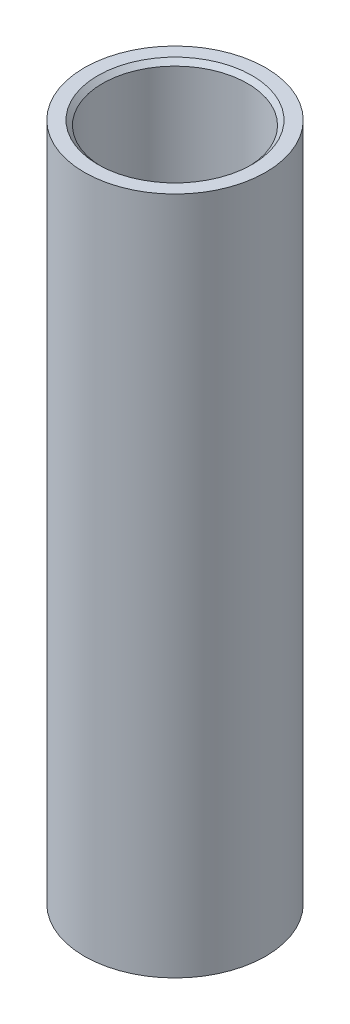
ISO-10303-21;
HEADER;
FILE_DESCRIPTION(('STEP AP214'),'2;1');
FILE_NAME('part.step','',(''),(''),'','','');
FILE_SCHEMA(('AUTOMOTIVE_DESIGN { 1 0 10303 214 1 1 1 1 }'));
ENDSEC;
DATA;
#1=APPLICATION_CONTEXT('core data for automotive mechanical design processes');
#2=APPLICATION_PROTOCOL_DEFINITION('international standard','automotive_design',2000,#1);
#3=PRODUCT_CONTEXT('',#1,'mechanical');
#4=PRODUCT('Part','Part','',(#3));
#5=PRODUCT_RELATED_PRODUCT_CATEGORY('part','',(#4));
#6=PRODUCT_DEFINITION_FORMATION('','',#4);
#7=PRODUCT_DEFINITION_CONTEXT('part definition',#1,'design');
#8=PRODUCT_DEFINITION('design','',#6,#7);
#9=PRODUCT_DEFINITION_SHAPE('','',#8);
#10=(LENGTH_UNIT() NAMED_UNIT(*) SI_UNIT(.MILLI.,.METRE.));
#11=(NAMED_UNIT(*) PLANE_ANGLE_UNIT() SI_UNIT($,.RADIAN.));
#12=(NAMED_UNIT(*) SI_UNIT($,.STERADIAN.) SOLID_ANGLE_UNIT());
#13=UNCERTAINTY_MEASURE_WITH_UNIT(LENGTH_MEASURE(1.E-05),#10,'distance_accuracy_value','');
#14=(GEOMETRIC_REPRESENTATION_CONTEXT(3) GLOBAL_UNCERTAINTY_ASSIGNED_CONTEXT((#13)) GLOBAL_UNIT_ASSIGNED_CONTEXT((#10,
#11,#12)) REPRESENTATION_CONTEXT('',''));
#15=CARTESIAN_POINT('',(0.,0.,0.));
#16=DIRECTION('',(0.,0.,1.));
#17=DIRECTION('',(1.,0.,0.));
#18=AXIS2_PLACEMENT_3D('',#15,#16,#17);
#19=CARTESIAN_POINT('',(0.,29.718,0.));
#20=DIRECTION('',(0.,1.,0.));
#21=DIRECTION('',(0.,0.,1.));
#22=AXIS2_PLACEMENT_3D('',#19,#20,#21);
#23=PLANE('',#22);
#24=CARTESIAN_POINT('',(0.,29.718,0.));
#25=DIRECTION('',(0.,1.,0.));
#26=DIRECTION('',(0.,0.,1.));
#27=AXIS2_PLACEMENT_3D('',#24,#25,#26);
#28=CIRCLE('',#27,3.375);
#29=CARTESIAN_POINT('',(0.,29.718,3.375));
#30=VERTEX_POINT('',#29);
#31=EDGE_CURVE('E10',#30,#30,#28,.F.);
#32=ORIENTED_EDGE('',*,*,#31,.T.);
#33=EDGE_LOOP('',(#32));
#34=FACE_BOUND('',#33,.T.);
#35=CARTESIAN_POINT('',(0.,29.718,0.));
#36=DIRECTION('',(0.,1.,0.));
#37=DIRECTION('',(0.,0.,1.));
#38=AXIS2_PLACEMENT_3D('',#35,#36,#37);
#39=CIRCLE('',#38,3.96875);
#40=CARTESIAN_POINT('',(0.,29.718,3.96875));
#41=VERTEX_POINT('',#40);
#42=EDGE_CURVE('E51',#41,#41,#39,.T.);
#43=ORIENTED_EDGE('',*,*,#42,.T.);
#44=EDGE_LOOP('',(#43));
#45=FACE_BOUND('',#44,.T.);
#46=ADVANCED_FACE('F31',(#34,#45),#23,.T.);
#47=CARTESIAN_POINT('',(0.,0.,0.));
#48=DIRECTION('',(0.,1.,0.));
#49=DIRECTION('',(0.,0.,1.));
#50=AXIS2_PLACEMENT_3D('',#47,#48,#49);
#51=PLANE('',#50);
#52=CARTESIAN_POINT('',(0.,0.,0.));
#53=DIRECTION('',(0.,1.,0.));
#54=DIRECTION('',(0.,0.,1.));
#55=AXIS2_PLACEMENT_3D('',#52,#53,#54);
#56=CIRCLE('',#55,3.375);
#57=CARTESIAN_POINT('',(0.,0.,3.375));
#58=VERTEX_POINT('',#57);
#59=EDGE_CURVE('E46',#58,#58,#56,.T.);
#60=ORIENTED_EDGE('',*,*,#59,.T.);
#61=EDGE_LOOP('',(#60));
#62=FACE_BOUND('',#61,.T.);
#63=CARTESIAN_POINT('',(0.,0.,0.));
#64=DIRECTION('',(0.,1.,0.));
#65=DIRECTION('',(0.,0.,1.));
#66=AXIS2_PLACEMENT_3D('',#63,#64,#65);
#67=CIRCLE('',#66,3.96875);
#68=CARTESIAN_POINT('',(0.,0.,3.96875));
#69=VERTEX_POINT('',#68);
#70=EDGE_CURVE('E52',#69,#69,#67,.T.);
#71=ORIENTED_EDGE('',*,*,#70,.F.);
#72=EDGE_LOOP('',(#71));
#73=FACE_BOUND('',#72,.T.);
#74=ADVANCED_FACE('F63',(#62,#73),#51,.F.);
#75=CARTESIAN_POINT('',(0.,29.718,0.));
#76=DIRECTION('',(0.,-1.,0.));
#77=DIRECTION('',(0.,0.,-1.));
#78=AXIS2_PLACEMENT_3D('',#75,#76,#77);
#79=CYLINDRICAL_SURFACE('',#78,3.96875);
#80=ORIENTED_EDGE('',*,*,#42,.F.);
#81=EDGE_LOOP('',(#80));
#82=FACE_BOUND('',#81,.T.);
#83=ORIENTED_EDGE('',*,*,#70,.T.);
#84=EDGE_LOOP('',(#83));
#85=FACE_BOUND('',#84,.T.);
#86=ADVANCED_FACE('F59',(#82,#85),#79,.T.);
#87=CARTESIAN_POINT('',(0.,29.718,0.));
#88=DIRECTION('',(0.,-1.,0.));
#89=DIRECTION('',(0.,0.,-1.));
#90=AXIS2_PLACEMENT_3D('',#87,#88,#89);
#91=CYLINDRICAL_SURFACE('',#90,3.175);
#92=CARTESIAN_POINT('',(0.,0.199999999999992,0.));
#93=DIRECTION('',(0.,1.,0.));
#94=DIRECTION('',(0.,0.,1.));
#95=AXIS2_PLACEMENT_3D('',#92,#93,#94);
#96=CIRCLE('',#95,3.175);
#97=CARTESIAN_POINT('',(0.,0.199999999999992,3.175));
#98=VERTEX_POINT('',#97);
#99=EDGE_CURVE('E38',#98,#98,#96,.F.);
#100=ORIENTED_EDGE('',*,*,#99,.T.);
#101=EDGE_LOOP('',(#100));
#102=FACE_BOUND('',#101,.T.);
#103=CARTESIAN_POINT('',(0.,29.518,0.));
#104=DIRECTION('',(0.,1.,0.));
#105=DIRECTION('',(0.,0.,1.));
#106=AXIS2_PLACEMENT_3D('',#103,#104,#105);
#107=CIRCLE('',#106,3.175);
#108=CARTESIAN_POINT('',(0.,29.518,3.175));
#109=VERTEX_POINT('',#108);
#110=EDGE_CURVE('E42',#109,#109,#107,.T.);
#111=ORIENTED_EDGE('',*,*,#110,.T.);
#112=EDGE_LOOP('',(#111));
#113=FACE_BOUND('',#112,.T.);
#114=ADVANCED_FACE('F62',(#102,#113),#91,.F.);
#115=CARTESIAN_POINT('',(0.,0.,0.));
#116=DIRECTION('',(0.,-1.,0.));
#117=DIRECTION('',(0.,0.,-1.));
#118=AXIS2_PLACEMENT_3D('',#115,#116,#117);
#119=CONICAL_SURFACE('',#118,3.375,0.785398163397459);
#120=ORIENTED_EDGE('',*,*,#99,.F.);
#121=EDGE_LOOP('',(#120));
#122=FACE_BOUND('',#121,.T.);
#123=ORIENTED_EDGE('',*,*,#59,.F.);
#124=EDGE_LOOP('',(#123));
#125=FACE_BOUND('',#124,.T.);
#126=ADVANCED_FACE('F75',(#122,#125),#119,.F.);
#127=CARTESIAN_POINT('',(0.,29.518,0.));
#128=DIRECTION('',(0.,1.,0.));
#129=DIRECTION('',(0.,0.,1.));
#130=AXIS2_PLACEMENT_3D('',#127,#128,#129);
#131=CONICAL_SURFACE('',#130,3.175,0.78539816339745);
#132=ORIENTED_EDGE('',*,*,#31,.F.);
#133=EDGE_LOOP('',(#132));
#134=FACE_BOUND('',#133,.T.);
#135=ORIENTED_EDGE('',*,*,#110,.F.);
#136=EDGE_LOOP('',(#135));
#137=FACE_BOUND('',#136,.T.);
#138=ADVANCED_FACE('F33',(#134,#137),#131,.F.);
#139=CLOSED_SHELL('',(#46,#74,#86,#114,#126,#138));
#140=MANIFOLD_SOLID_BREP('B2',#139);
#141=ADVANCED_BREP_SHAPE_REPRESENTATION('',(#18,#140),#14);
#142=SHAPE_DEFINITION_REPRESENTATION(#9,#141);
ENDSEC;
END-ISO-10303-21;
